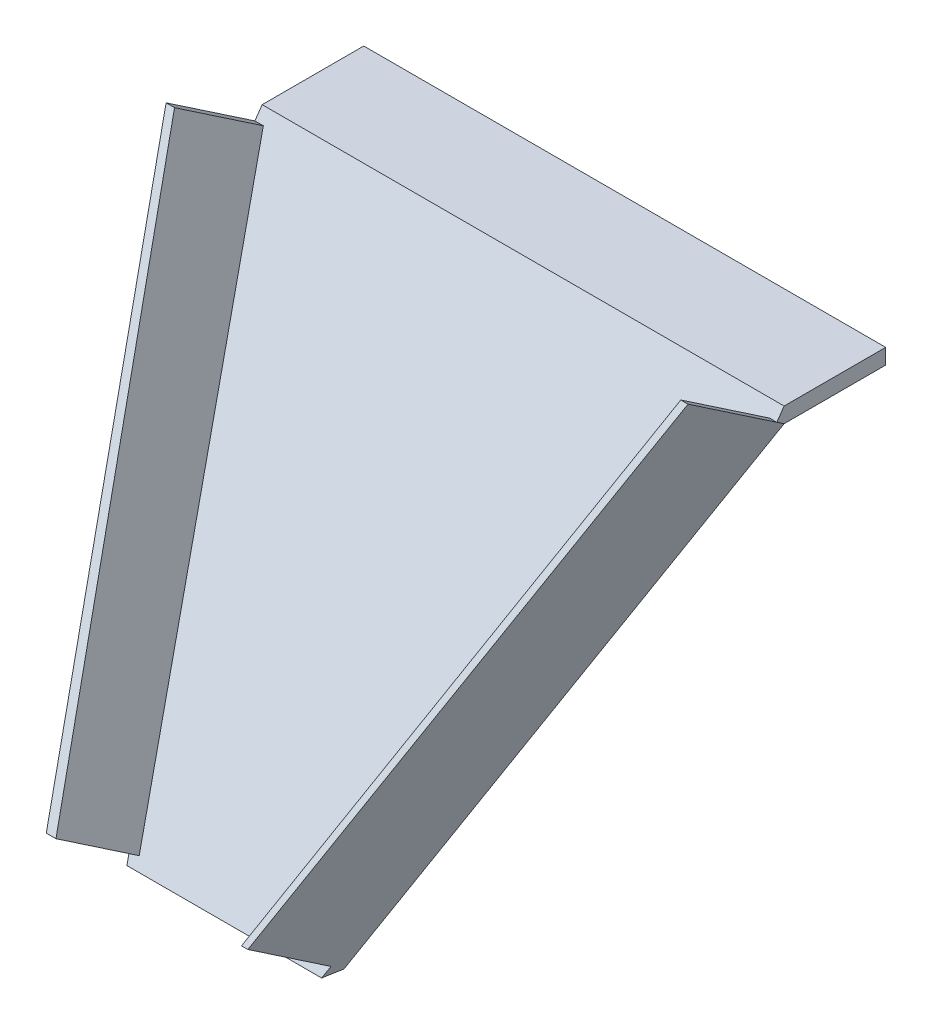
ISO-10303-21;
HEADER;
FILE_DESCRIPTION(('STEP AP214'),'2;1');
FILE_NAME('part.step','',(''),(''),'','','');
FILE_SCHEMA(('AUTOMOTIVE_DESIGN { 1 0 10303 214 1 1 1 1 }'));
ENDSEC;
DATA;
#1=APPLICATION_CONTEXT('core data for automotive mechanical design processes');
#2=APPLICATION_PROTOCOL_DEFINITION('international standard','automotive_design',2000,#1);
#3=PRODUCT_CONTEXT('',#1,'mechanical');
#4=PRODUCT('Part','Part','',(#3));
#5=PRODUCT_RELATED_PRODUCT_CATEGORY('part','',(#4));
#6=PRODUCT_DEFINITION_FORMATION('','',#4);
#7=PRODUCT_DEFINITION_CONTEXT('part definition',#1,'design');
#8=PRODUCT_DEFINITION('design','',#6,#7);
#9=PRODUCT_DEFINITION_SHAPE('','',#8);
#10=(LENGTH_UNIT() NAMED_UNIT(*) SI_UNIT(.MILLI.,.METRE.));
#11=(NAMED_UNIT(*) PLANE_ANGLE_UNIT() SI_UNIT($,.RADIAN.));
#12=(NAMED_UNIT(*) SI_UNIT($,.STERADIAN.) SOLID_ANGLE_UNIT());
#13=UNCERTAINTY_MEASURE_WITH_UNIT(LENGTH_MEASURE(1.E-05),#10,'distance_accuracy_value','');
#14=(GEOMETRIC_REPRESENTATION_CONTEXT(3) GLOBAL_UNCERTAINTY_ASSIGNED_CONTEXT((#13)) GLOBAL_UNIT_ASSIGNED_CONTEXT((#10,
#11,#12)) REPRESENTATION_CONTEXT('',''));
#15=CARTESIAN_POINT('',(0.,0.,0.));
#16=DIRECTION('',(0.,0.,1.));
#17=DIRECTION('',(1.,0.,0.));
#18=AXIS2_PLACEMENT_3D('',#15,#16,#17);
#19=CARTESIAN_POINT('',(90.,-36.9293149647872,25.7143091727455));
#20=DIRECTION('',(0.,-0.571429092727677,-0.820651443661938));
#21=DIRECTION('',(0.,0.820651443661939,-0.571429092727677));
#22=AXIS2_PLACEMENT_3D('',#19,#20,#21);
#23=PLANE('',#22);
#24=DIRECTION('',(0.,-0.820651443661939,0.571429092727677));
#25=VECTOR('',#24,1.);
#26=CARTESIAN_POINT('',(0.,-36.9293149647872,25.7143091727455));
#27=LINE('',#26,#25);
#28=CARTESIAN_POINT('',(0.,36.9293149647872,-25.7143091727455));
#29=VERTEX_POINT('',#28);
#30=CARTESIAN_POINT('',(0.,35.1297081186427,-24.4612221096555));
#31=VERTEX_POINT('',#30);
#32=EDGE_CURVE('E226',#29,#31,#27,.T.);
#33=ORIENTED_EDGE('',*,*,#32,.T.);
#34=DIRECTION('',(1.,0.,0.));
#35=VECTOR('',#34,1.);
#36=CARTESIAN_POINT('',(90.,35.1297081186427,-24.4612221096555));
#37=LINE('',#36,#35);
#38=CARTESIAN_POINT('',(1.45587804217857,35.1297081186427,-24.4612221096555));
#39=VERTEX_POINT('',#38);
#40=EDGE_CURVE('E11',#31,#39,#37,.T.);
#41=ORIENTED_EDGE('',*,*,#40,.T.);
#42=DIRECTION('',(0.306921069880364,-0.781042678727612,0.543849051547844));
#43=VECTOR('',#42,1.);
#44=CARTESIAN_POINT('',(35.445896171002,-51.3669759300753,35.7674195038387));
#45=LINE('',#44,#43);
#46=CARTESIAN_POINT('',(29.1844345893238,-35.4330137279682,24.6724173137762));
#47=VERTEX_POINT('',#46);
#48=EDGE_CURVE('E47',#39,#47,#45,.T.);
#49=ORIENTED_EDGE('',*,*,#48,.T.);
#50=DIRECTION('',(-1.,0.,0.));
#51=VECTOR('',#50,1.);
#52=CARTESIAN_POINT('',(90.,-35.4330137279682,24.6724173137762));
#53=LINE('',#52,#51);
#54=CARTESIAN_POINT('',(27.5187848006722,-35.4330137279682,24.6724173137762));
#55=VERTEX_POINT('',#54);
#56=EDGE_CURVE('E170',#47,#55,#53,.T.);
#57=ORIENTED_EDGE('',*,*,#56,.T.);
#58=DIRECTION('',(-0.30481563473319,0.78159777054003,-0.544235568397598));
#59=VECTOR('',#58,1.);
#60=CARTESIAN_POINT('',(33.8533997946787,-51.676015701534,35.9826074713799));
#61=LINE('',#60,#59);
#62=CARTESIAN_POINT('',(28.102327933015,-36.9293149647872,25.7143091727454));
#63=VERTEX_POINT('',#62);
#64=EDGE_CURVE('E203',#63,#55,#61,.T.);
#65=ORIENTED_EDGE('',*,*,#64,.F.);
#66=DIRECTION('',(-1.,0.,0.));
#67=VECTOR('',#66,1.);
#68=CARTESIAN_POINT('',(90.,-36.9293149647872,25.7143091727455));
#69=LINE('',#68,#67);
#70=CARTESIAN_POINT('',(61.6828527856791,-36.9293149647872,25.7143091727455));
#71=VERTEX_POINT('',#70);
#72=EDGE_CURVE('E241',#71,#63,#69,.T.);
#73=ORIENTED_EDGE('',*,*,#72,.F.);
#74=DIRECTION('',(0.306926953426735,0.781041121639498,-0.543847967329379));
#75=VECTOR('',#74,1.);
#76=CARTESIAN_POINT('',(64.3504457036472,-30.1410556038357,20.9875656596656));
#77=LINE('',#76,#75);
#78=CARTESIAN_POINT('',(62.2708566273482,-35.4330137279682,24.6724173137762));
#79=VERTEX_POINT('',#78);
#80=EDGE_CURVE('E209',#71,#79,#77,.T.);
#81=ORIENTED_EDGE('',*,*,#80,.T.);
#82=DIRECTION('',(-1.,0.,0.));
#83=VECTOR('',#82,1.);
#84=CARTESIAN_POINT('',(90.,-35.4330137279682,24.6724173137762));
#85=LINE('',#84,#83);
#86=CARTESIAN_POINT('',(61.177479126101,-35.4330137279682,24.6724173137762));
#87=VERTEX_POINT('',#86);
#88=EDGE_CURVE('E186',#79,#87,#85,.T.);
#89=ORIENTED_EDGE('',*,*,#88,.T.);
#90=DIRECTION('',(0.305382790418016,0.781448656351428,-0.544131738463265));
#91=VECTOR('',#90,1.);
#92=CARTESIAN_POINT('',(63.3352201193224,-29.9115375583413,20.827749589744));
#93=LINE('',#92,#91);
#94=CARTESIAN_POINT('',(88.7527276365004,35.1297081186427,-24.4612221096555));
#95=VERTEX_POINT('',#94);
#96=EDGE_CURVE('E254',#87,#95,#93,.T.);
#97=ORIENTED_EDGE('',*,*,#96,.T.);
#98=DIRECTION('',(1.,0.,0.));
#99=VECTOR('',#98,1.);
#100=CARTESIAN_POINT('',(90.,35.1297081186427,-24.4612221096555));
#101=LINE('',#100,#99);
#102=CARTESIAN_POINT('',(90.,35.1297081186427,-24.4612221096555));
#103=VERTEX_POINT('',#102);
#104=EDGE_CURVE('E256',#95,#103,#101,.T.);
#105=ORIENTED_EDGE('',*,*,#104,.T.);
#106=DIRECTION('',(0.,-0.820651443661939,0.571429092727677));
#107=VECTOR('',#106,1.);
#108=CARTESIAN_POINT('',(90.,-36.9293149647872,25.7143091727455));
#109=LINE('',#108,#107);
#110=CARTESIAN_POINT('',(90.,36.9293149647872,-25.7143091727455));
#111=VERTEX_POINT('',#110);
#112=EDGE_CURVE('E220',#111,#103,#109,.T.);
#113=ORIENTED_EDGE('',*,*,#112,.F.);
#114=DIRECTION('',(-1.,0.,0.));
#115=VECTOR('',#114,1.);
#116=CARTESIAN_POINT('',(90.,36.9293149647872,-25.7143091727455));
#117=LINE('',#116,#115);
#118=EDGE_CURVE('E247',#111,#29,#117,.T.);
#119=ORIENTED_EDGE('',*,*,#118,.T.);
#120=EDGE_LOOP('',(#33,#41,#49,#57,#65,#73,#81,#89,#97,#105,#113,#119));
#121=FACE_BOUND('',#120,.T.);
#122=ADVANCED_FACE('F41',(#121),#23,.F.);
#123=CARTESIAN_POINT('',(90.,-36.9293149647872,22.460611747735));
#124=DIRECTION('',(0.,1.,0.));
#125=DIRECTION('',(0.,0.,1.));
#126=AXIS2_PLACEMENT_3D('',#123,#124,#125);
#127=PLANE('',#126);
#128=DIRECTION('',(0.176531051945329,0.,0.984295071459304));
#129=VECTOR('',#128,1.);
#130=CARTESIAN_POINT('',(29.4659001747486,-36.9293149647872,33.3172630005672));
#131=LINE('',#130,#129);
#132=CARTESIAN_POINT('',(27.5187848006722,-36.9293149647872,22.460611747735));
#133=VERTEX_POINT('',#132);
#134=EDGE_CURVE('E200',#133,#63,#131,.T.);
#135=ORIENTED_EDGE('',*,*,#134,.F.);
#136=DIRECTION('',(-1.,0.,0.));
#137=VECTOR('',#136,1.);
#138=CARTESIAN_POINT('',(90.,-36.9293149647872,22.460611747735));
#139=LINE('',#138,#137);
#140=CARTESIAN_POINT('',(62.2708566273482,-36.9293149647872,22.460611747735));
#141=VERTEX_POINT('',#140);
#142=EDGE_CURVE('E243',#141,#133,#139,.T.);
#143=ORIENTED_EDGE('',*,*,#142,.F.);
#144=DIRECTION('',(-0.177837966354275,0.,0.984059783612244));
#145=VECTOR('',#144,1.);
#146=CARTESIAN_POINT('',(63.1478280067003,-36.9293149647872,17.6079231824585));
#147=LINE('',#146,#145);
#148=EDGE_CURVE('E210',#141,#71,#147,.T.);
#149=ORIENTED_EDGE('',*,*,#148,.T.);
#150=ORIENTED_EDGE('',*,*,#72,.T.);
#151=EDGE_LOOP('',(#135,#143,#149,#150));
#152=FACE_BOUND('',#151,.T.);
#153=ADVANCED_FACE('F292',(#152),#127,.F.);
#154=CARTESIAN_POINT('',(90.,34.2819863518061,-25.7143091727455));
#155=DIRECTION('',(0.,0.560329875322556,0.828269539957259));
#156=DIRECTION('',(0.,-0.828269539957259,0.560329875322556));
#157=AXIS2_PLACEMENT_3D('',#154,#155,#156);
#158=PLANE('',#157);
#159=DIRECTION('',(0.304840690956023,-0.788846689796331,0.53366005390588));
#160=VECTOR('',#159,1.);
#161=CARTESIAN_POINT('',(8.3635062176291,12.6394550539764,-11.0729922115988));
#162=LINE('',#161,#160);
#163=CARTESIAN_POINT('',(0.,34.2819863518061,-25.7143091727455));
#164=VERTEX_POINT('',#163);
#165=EDGE_CURVE('E198',#164,#133,#162,.T.);
#166=ORIENTED_EDGE('',*,*,#165,.F.);
#167=DIRECTION('',(-1.,0.,0.));
#168=VECTOR('',#167,1.);
#169=CARTESIAN_POINT('',(90.,34.2819863518061,-25.7143091727455));
#170=LINE('',#169,#168);
#171=CARTESIAN_POINT('',(90.,34.2819863518061,-25.7143091727455));
#172=VERTEX_POINT('',#171);
#173=EDGE_CURVE('E239',#172,#164,#170,.T.);
#174=ORIENTED_EDGE('',*,*,#173,.F.);
#175=DIRECTION('',(-0.306952147273986,-0.788284785993833,0.533279922230854));
#176=VECTOR('',#175,1.);
#177=CARTESIAN_POINT('',(90.,34.2819863518061,-25.7143091727455));
#178=LINE('',#177,#176);
#179=EDGE_CURVE('E204',#172,#141,#178,.T.);
#180=ORIENTED_EDGE('',*,*,#179,.T.);
#181=ORIENTED_EDGE('',*,*,#142,.T.);
#182=EDGE_LOOP('',(#166,#174,#180,#181));
#183=FACE_BOUND('',#182,.T.);
#184=ADVANCED_FACE('F290',(#183),#158,.F.);
#185=CARTESIAN_POINT('',(90.,36.9293149647872,-25.7143091727455));
#186=DIRECTION('',(0.,-1.,0.));
#187=DIRECTION('',(0.,0.,-1.));
#188=AXIS2_PLACEMENT_3D('',#185,#186,#187);
#189=PLANE('',#188);
#190=DIRECTION('',(0.,0.,1.));
#191=VECTOR('',#190,1.);
#192=CARTESIAN_POINT('',(0.,36.9293149647872,-25.7143091727455));
#193=LINE('',#192,#191);
#194=CARTESIAN_POINT('',(0.,36.9293149647872,-43.2324556948885));
#195=VERTEX_POINT('',#194);
#196=EDGE_CURVE('E213',#195,#29,#193,.T.);
#197=ORIENTED_EDGE('',*,*,#196,.T.);
#198=ORIENTED_EDGE('',*,*,#118,.F.);
#199=DIRECTION('',(0.,0.,1.));
#200=VECTOR('',#199,1.);
#201=CARTESIAN_POINT('',(90.,36.9293149647872,-25.7143091727455));
#202=LINE('',#201,#200);
#203=CARTESIAN_POINT('',(90.,36.9293149647872,-43.2324556948885));
#204=VERTEX_POINT('',#203);
#205=EDGE_CURVE('E212',#204,#111,#202,.T.);
#206=ORIENTED_EDGE('',*,*,#205,.F.);
#207=DIRECTION('',(-1.,0.,0.));
#208=VECTOR('',#207,1.);
#209=CARTESIAN_POINT('',(90.,36.9293149647872,-43.2324556948885));
#210=LINE('',#209,#208);
#211=EDGE_CURVE('E223',#204,#195,#210,.T.);
#212=ORIENTED_EDGE('',*,*,#211,.T.);
#213=EDGE_LOOP('',(#197,#198,#206,#212));
#214=FACE_BOUND('',#213,.T.);
#215=ADVANCED_FACE('F43',(#214),#189,.F.);
#216=CARTESIAN_POINT('',(90.,34.2819863518061,-43.2324556948885));
#217=DIRECTION('',(0.,1.,0.));
#218=DIRECTION('',(0.,0.,1.));
#219=AXIS2_PLACEMENT_3D('',#216,#217,#218);
#220=PLANE('',#219);
#221=DIRECTION('',(0.,0.,-1.));
#222=VECTOR('',#221,1.);
#223=CARTESIAN_POINT('',(0.,34.2819863518061,-43.2324556948885));
#224=LINE('',#223,#222);
#225=CARTESIAN_POINT('',(0.,34.2819863518061,-43.2324556948885));
#226=VERTEX_POINT('',#225);
#227=EDGE_CURVE('E232',#164,#226,#224,.T.);
#228=ORIENTED_EDGE('',*,*,#227,.T.);
#229=DIRECTION('',(-1.,0.,0.));
#230=VECTOR('',#229,1.);
#231=CARTESIAN_POINT('',(90.,34.2819863518061,-43.2324556948885));
#232=LINE('',#231,#230);
#233=CARTESIAN_POINT('',(90.,34.2819863518061,-43.2324556948885));
#234=VERTEX_POINT('',#233);
#235=EDGE_CURVE('E237',#234,#226,#232,.T.);
#236=ORIENTED_EDGE('',*,*,#235,.F.);
#237=DIRECTION('',(0.,0.,-1.));
#238=VECTOR('',#237,1.);
#239=CARTESIAN_POINT('',(90.,34.2819863518061,-43.2324556948885));
#240=LINE('',#239,#238);
#241=EDGE_CURVE('E222',#172,#234,#240,.T.);
#242=ORIENTED_EDGE('',*,*,#241,.F.);
#243=ORIENTED_EDGE('',*,*,#173,.T.);
#244=EDGE_LOOP('',(#228,#236,#242,#243));
#245=FACE_BOUND('',#244,.T.);
#246=ADVANCED_FACE('F272',(#245),#220,.F.);
#247=CARTESIAN_POINT('',(90.,36.9293149647872,-43.2324556948885));
#248=DIRECTION('',(0.,0.,1.));
#249=DIRECTION('',(1.,0.,0.));
#250=AXIS2_PLACEMENT_3D('',#247,#248,#249);
#251=PLANE('',#250);
#252=DIRECTION('',(0.,1.,0.));
#253=VECTOR('',#252,1.);
#254=CARTESIAN_POINT('',(0.,36.9293149647872,-43.2324556948885));
#255=LINE('',#254,#253);
#256=EDGE_CURVE('E217',#226,#195,#255,.T.);
#257=ORIENTED_EDGE('',*,*,#256,.T.);
#258=ORIENTED_EDGE('',*,*,#211,.F.);
#259=DIRECTION('',(0.,1.,0.));
#260=VECTOR('',#259,1.);
#261=CARTESIAN_POINT('',(90.,36.9293149647872,-43.2324556948885));
#262=LINE('',#261,#260);
#263=EDGE_CURVE('E224',#234,#204,#262,.T.);
#264=ORIENTED_EDGE('',*,*,#263,.F.);
#265=ORIENTED_EDGE('',*,*,#235,.T.);
#266=EDGE_LOOP('',(#257,#258,#264,#265));
#267=FACE_BOUND('',#266,.T.);
#268=ADVANCED_FACE('F279',(#267),#251,.F.);
#269=CARTESIAN_POINT('',(90.,0.,0.));
#270=DIRECTION('',(-1.,0.,0.));
#271=DIRECTION('',(0.,0.,1.));
#272=AXIS2_PLACEMENT_3D('',#269,#270,#271);
#273=PLANE('',#272);
#274=ORIENTED_EDGE('',*,*,#112,.T.);
#275=DIRECTION('',(0.,-0.560329875322556,-0.828269539957259));
#276=VECTOR('',#275,1.);
#277=CARTESIAN_POINT('',(90.,35.4526039321256,-23.9839233278734));
#278=LINE('',#277,#276);
#279=EDGE_CURVE('E246',#103,#172,#278,.T.);
#280=ORIENTED_EDGE('',*,*,#279,.T.);
#281=ORIENTED_EDGE('',*,*,#241,.T.);
#282=ORIENTED_EDGE('',*,*,#263,.T.);
#283=ORIENTED_EDGE('',*,*,#205,.T.);
#284=EDGE_LOOP('',(#274,#280,#281,#282,#283));
#285=FACE_BOUND('',#284,.T.);
#286=ADVANCED_FACE('F285',(#285),#273,.F.);
#287=CARTESIAN_POINT('',(0.,0.,0.));
#288=DIRECTION('',(-1.,0.,0.));
#289=DIRECTION('',(0.,0.,1.));
#290=AXIS2_PLACEMENT_3D('',#287,#288,#289);
#291=PLANE('',#290);
#292=DIRECTION('',(0.,-0.560329875322556,-0.828269539957259));
#293=VECTOR('',#292,1.);
#294=CARTESIAN_POINT('',(0.,35.4526039321256,-23.9839233278734));
#295=LINE('',#294,#293);
#296=EDGE_CURVE('E252',#31,#164,#295,.T.);
#297=ORIENTED_EDGE('',*,*,#296,.F.);
#298=ORIENTED_EDGE('',*,*,#32,.F.);
#299=ORIENTED_EDGE('',*,*,#196,.F.);
#300=ORIENTED_EDGE('',*,*,#256,.F.);
#301=ORIENTED_EDGE('',*,*,#227,.F.);
#302=EDGE_LOOP('',(#297,#298,#299,#300,#301));
#303=FACE_BOUND('',#302,.T.);
#304=ADVANCED_FACE('F268',(#303),#291,.T.);
#305=CARTESIAN_POINT('',(90.,3.79355993918753,-70.7817525323621));
#306=DIRECTION('',(-0.951724949386055,0.254239113811517,-0.171994458412024));
#307=DIRECTION('',(-0.25808511965984,-0.966122182236888,0.));
#308=AXIS2_PLACEMENT_3D('',#305,#306,#307);
#309=PLANE('',#308);
#310=ORIENTED_EDGE('',*,*,#279,.F.);
#311=DIRECTION('',(0.,-0.560329875322556,-0.828269539957259));
#312=VECTOR('',#311,1.);
#313=CARTESIAN_POINT('',(90.,45.4885838582572,-9.14891837360031));
#314=LINE('',#313,#312);
#315=CARTESIAN_POINT('',(90.,45.4885838582572,-9.14891837360031));
#316=VERTEX_POINT('',#315);
#317=EDGE_CURVE('E184',#316,#103,#314,.T.);
#318=ORIENTED_EDGE('',*,*,#317,.F.);
#319=DIRECTION('',(-0.306952147273986,-0.788284785993833,0.533279922230854));
#320=VECTOR('',#319,1.);
#321=CARTESIAN_POINT('',(90.,45.4885838582572,-9.14891837360031));
#322=LINE('',#321,#320);
#323=CARTESIAN_POINT('',(62.2708566273482,-25.7227174583361,39.0260025468802));
#324=VERTEX_POINT('',#323);
#325=EDGE_CURVE('E177',#316,#324,#322,.T.);
#326=ORIENTED_EDGE('',*,*,#325,.T.);
#327=DIRECTION('',(0.,-0.560329875322556,-0.828269539957259));
#328=VECTOR('',#327,1.);
#329=CARTESIAN_POINT('',(62.2708566273482,-25.7227174583361,39.0260025468802));
#330=LINE('',#329,#328);
#331=EDGE_CURVE('E187',#324,#79,#330,.T.);
#332=ORIENTED_EDGE('',*,*,#331,.T.);
#333=ORIENTED_EDGE('',*,*,#80,.F.);
#334=ORIENTED_EDGE('',*,*,#148,.F.);
#335=ORIENTED_EDGE('',*,*,#179,.F.);
#336=EDGE_LOOP('',(#310,#318,#326,#332,#333,#334,#335));
#337=FACE_BOUND('',#336,.T.);
#338=ADVANCED_FACE('F318',(#337),#309,.F.);
#339=CARTESIAN_POINT('',(0.,3.79355993918753,-70.7817525323621));
#340=DIRECTION('',(-0.952403356324123,-0.252490258858398,0.17081134635663));
#341=DIRECTION('',(0.256256264439573,-0.966608880021012,0.));
#342=AXIS2_PLACEMENT_3D('',#339,#340,#341);
#343=PLANE('',#342);
#344=ORIENTED_EDGE('',*,*,#165,.T.);
#345=ORIENTED_EDGE('',*,*,#134,.T.);
#346=ORIENTED_EDGE('',*,*,#64,.T.);
#347=DIRECTION('',(0.,-0.560329875322556,-0.828269539957259));
#348=VECTOR('',#347,1.);
#349=CARTESIAN_POINT('',(27.5187848006722,-25.7227174583361,39.0260025468802));
#350=LINE('',#349,#348);
#351=CARTESIAN_POINT('',(27.5187848006722,-25.7227174583361,39.0260025468802));
#352=VERTEX_POINT('',#351);
#353=EDGE_CURVE('E169',#352,#55,#350,.T.);
#354=ORIENTED_EDGE('',*,*,#353,.F.);
#355=DIRECTION('',(-0.304840690956023,0.788846689796331,-0.53366005390588));
#356=VECTOR('',#355,1.);
#357=CARTESIAN_POINT('',(12.4271145956202,13.3305140752147,12.6062306000974));
#358=LINE('',#357,#356);
#359=CARTESIAN_POINT('',(0.,45.4885838582572,-9.14891837360031));
#360=VERTEX_POINT('',#359);
#361=EDGE_CURVE('E150',#352,#360,#358,.T.);
#362=ORIENTED_EDGE('',*,*,#361,.T.);
#363=DIRECTION('',(0.,-0.560329875322556,-0.828269539957259));
#364=VECTOR('',#363,1.);
#365=CARTESIAN_POINT('',(0.,45.4885838582572,-9.14891837360031));
#366=LINE('',#365,#364);
#367=EDGE_CURVE('E161',#360,#31,#366,.T.);
#368=ORIENTED_EDGE('',*,*,#367,.T.);
#369=ORIENTED_EDGE('',*,*,#296,.T.);
#370=EDGE_LOOP('',(#344,#345,#346,#354,#362,#368,#369));
#371=FACE_BOUND('',#370,.T.);
#372=ADVANCED_FACE('F262',(#371),#343,.T.);
#373=CARTESIAN_POINT('',(88.7527276365004,45.4885838582572,-9.14891837360031));
#374=DIRECTION('',(0.,0.828269539957259,-0.560329875322556));
#375=DIRECTION('',(0.,0.560329875322556,0.828269539957259));
#376=AXIS2_PLACEMENT_3D('',#373,#374,#375);
#377=PLANE('',#376);
#378=ORIENTED_EDGE('',*,*,#104,.F.);
#379=DIRECTION('',(0.,-0.560329875322556,-0.828269539957259));
#380=VECTOR('',#379,1.);
#381=CARTESIAN_POINT('',(88.7527276365004,45.4885838582572,-9.14891837360031));
#382=LINE('',#381,#380);
#383=CARTESIAN_POINT('',(88.7527276365004,45.4885838582572,-9.14891837360031));
#384=VERTEX_POINT('',#383);
#385=EDGE_CURVE('E183',#384,#95,#382,.T.);
#386=ORIENTED_EDGE('',*,*,#385,.F.);
#387=DIRECTION('',(1.,0.,0.));
#388=VECTOR('',#387,1.);
#389=CARTESIAN_POINT('',(88.7527276365004,45.4885838582572,-9.14891837360031));
#390=LINE('',#389,#388);
#391=EDGE_CURVE('E171',#384,#316,#390,.T.);
#392=ORIENTED_EDGE('',*,*,#391,.T.);
#393=ORIENTED_EDGE('',*,*,#317,.T.);
#394=EDGE_LOOP('',(#378,#386,#392,#393));
#395=FACE_BOUND('',#394,.T.);
#396=ADVANCED_FACE('F324',(#395),#377,.T.);
#397=CARTESIAN_POINT('',(88.7527276365004,45.4885838582572,-9.14891837360031));
#398=DIRECTION('',(-0.952221625770053,0.252960047317586,-0.171129161386721));
#399=DIRECTION('',(-0.256747430540851,-0.966478534117893,0.));
#400=AXIS2_PLACEMENT_3D('',#397,#398,#399);
#401=PLANE('',#400);
#402=ORIENTED_EDGE('',*,*,#96,.F.);
#403=DIRECTION('',(0.,-0.560329875322556,-0.828269539957259));
#404=VECTOR('',#403,1.);
#405=CARTESIAN_POINT('',(61.177479126101,-25.7227174583361,39.0260025468802));
#406=LINE('',#405,#404);
#407=CARTESIAN_POINT('',(61.177479126101,-25.7227174583361,39.0260025468802));
#408=VERTEX_POINT('',#407);
#409=EDGE_CURVE('E64',#408,#87,#406,.T.);
#410=ORIENTED_EDGE('',*,*,#409,.F.);
#411=DIRECTION('',(0.305407883683178,0.788696167913915,-0.533558224847175));
#412=VECTOR('',#411,1.);
#413=CARTESIAN_POINT('',(88.7527276365004,45.4885838582572,-9.14891837360031));
#414=LINE('',#413,#412);
#415=EDGE_CURVE('E182',#408,#384,#414,.T.);
#416=ORIENTED_EDGE('',*,*,#415,.T.);
#417=ORIENTED_EDGE('',*,*,#385,.T.);
#418=EDGE_LOOP('',(#402,#410,#416,#417));
#419=FACE_BOUND('',#418,.T.);
#420=ADVANCED_FACE('F327',(#419),#401,.T.);
#421=CARTESIAN_POINT('',(62.2708566273482,-25.7227174583361,39.0260025468802));
#422=DIRECTION('',(0.,-0.828269539957259,0.560329875322556));
#423=DIRECTION('',(0.,-0.560329875322556,-0.828269539957259));
#424=AXIS2_PLACEMENT_3D('',#421,#422,#423);
#425=PLANE('',#424);
#426=ORIENTED_EDGE('',*,*,#88,.F.);
#427=ORIENTED_EDGE('',*,*,#331,.F.);
#428=DIRECTION('',(-1.,0.,0.));
#429=VECTOR('',#428,1.);
#430=CARTESIAN_POINT('',(62.2708566273482,-25.7227174583361,39.0260025468802));
#431=LINE('',#430,#429);
#432=EDGE_CURVE('E176',#324,#408,#431,.T.);
#433=ORIENTED_EDGE('',*,*,#432,.T.);
#434=ORIENTED_EDGE('',*,*,#409,.T.);
#435=EDGE_LOOP('',(#426,#427,#433,#434));
#436=FACE_BOUND('',#435,.T.);
#437=ADVANCED_FACE('F329',(#436),#425,.T.);
#438=CARTESIAN_POINT('',(0.,10.0359799261316,14.8350049542731));
#439=DIRECTION('',(0.,-0.560329875322556,-0.828269539957259));
#440=DIRECTION('',(0.,0.828269539957259,-0.560329875322556));
#441=AXIS2_PLACEMENT_3D('',#438,#439,#440);
#442=PLANE('',#441);
#443=ORIENTED_EDGE('',*,*,#391,.F.);
#444=ORIENTED_EDGE('',*,*,#415,.F.);
#445=ORIENTED_EDGE('',*,*,#432,.F.);
#446=ORIENTED_EDGE('',*,*,#325,.F.);
#447=EDGE_LOOP('',(#443,#444,#445,#446));
#448=FACE_BOUND('',#447,.T.);
#449=ADVANCED_FACE('F334',(#448),#442,.F.);
#450=CARTESIAN_POINT('',(0.,45.4885838582572,-9.14891837360031));
#451=DIRECTION('',(0.,0.828269539957259,-0.560329875322556));
#452=DIRECTION('',(0.,0.560329875322556,0.828269539957259));
#453=AXIS2_PLACEMENT_3D('',#450,#451,#452);
#454=PLANE('',#453);
#455=ORIENTED_EDGE('',*,*,#40,.F.);
#456=ORIENTED_EDGE('',*,*,#367,.F.);
#457=DIRECTION('',(1.,0.,0.));
#458=VECTOR('',#457,1.);
#459=CARTESIAN_POINT('',(0.,45.4885838582572,-9.14891837360031));
#460=LINE('',#459,#458);
#461=CARTESIAN_POINT('',(1.45587804217857,45.4885838582572,-9.14891837360031));
#462=VERTEX_POINT('',#461);
#463=EDGE_CURVE('E152',#360,#462,#460,.T.);
#464=ORIENTED_EDGE('',*,*,#463,.T.);
#465=DIRECTION('',(0.,-0.560329875322556,-0.828269539957259));
#466=VECTOR('',#465,1.);
#467=CARTESIAN_POINT('',(1.45587804217857,45.4885838582572,-9.14891837360031));
#468=LINE('',#467,#466);
#469=EDGE_CURVE('E138',#462,#39,#468,.T.);
#470=ORIENTED_EDGE('',*,*,#469,.T.);
#471=EDGE_LOOP('',(#455,#456,#464,#470));
#472=FACE_BOUND('',#471,.T.);
#473=ADVANCED_FACE('F157',(#472),#454,.T.);
#474=CARTESIAN_POINT('',(13.8227730645994,13.7284492729986,12.3370247812136));
#475=DIRECTION('',(0.95172684706194,0.254234240332473,-0.171991161470903));
#476=DIRECTION('',(-0.258080021651755,0.966123544079239,0.));
#477=AXIS2_PLACEMENT_3D('',#474,#475,#476);
#478=PLANE('',#477);
#479=ORIENTED_EDGE('',*,*,#48,.F.);
#480=ORIENTED_EDGE('',*,*,#469,.F.);
#481=DIRECTION('',(0.306946263345133,-0.788286357780965,0.533280985555346));
#482=VECTOR('',#481,1.);
#483=CARTESIAN_POINT('',(13.8227730645994,13.7284492729986,12.3370247812136));
#484=LINE('',#483,#482);
#485=CARTESIAN_POINT('',(29.1844345893238,-25.7227174583361,39.0260025468802));
#486=VERTEX_POINT('',#485);
#487=EDGE_CURVE('E141',#462,#486,#484,.T.);
#488=ORIENTED_EDGE('',*,*,#487,.T.);
#489=DIRECTION('',(0.,-0.560329875322556,-0.828269539957259));
#490=VECTOR('',#489,1.);
#491=CARTESIAN_POINT('',(29.1844345893238,-25.7227174583361,39.0260025468802));
#492=LINE('',#491,#490);
#493=EDGE_CURVE('E57',#486,#47,#492,.T.);
#494=ORIENTED_EDGE('',*,*,#493,.T.);
#495=EDGE_LOOP('',(#479,#480,#488,#494));
#496=FACE_BOUND('',#495,.T.);
#497=ADVANCED_FACE('F142',(#496),#478,.T.);
#498=CARTESIAN_POINT('',(0.,-25.7227174583361,39.0260025468802));
#499=DIRECTION('',(0.,-0.828269539957259,0.560329875322556));
#500=DIRECTION('',(0.,-0.560329875322556,-0.828269539957259));
#501=AXIS2_PLACEMENT_3D('',#498,#499,#500);
#502=PLANE('',#501);
#503=ORIENTED_EDGE('',*,*,#56,.F.);
#504=ORIENTED_EDGE('',*,*,#493,.F.);
#505=DIRECTION('',(-1.,0.,0.));
#506=VECTOR('',#505,1.);
#507=CARTESIAN_POINT('',(0.,-25.7227174583361,39.0260025468802));
#508=LINE('',#507,#506);
#509=EDGE_CURVE('E160',#486,#352,#508,.T.);
#510=ORIENTED_EDGE('',*,*,#509,.T.);
#511=ORIENTED_EDGE('',*,*,#353,.T.);
#512=EDGE_LOOP('',(#503,#504,#510,#511));
#513=FACE_BOUND('',#512,.T.);
#514=ADVANCED_FACE('F294',(#513),#502,.T.);
#515=CARTESIAN_POINT('',(0.,10.0359799261316,14.8350049542731));
#516=DIRECTION('',(0.,-0.560329875322556,-0.828269539957259));
#517=DIRECTION('',(0.,0.828269539957259,-0.560329875322556));
#518=AXIS2_PLACEMENT_3D('',#515,#516,#517);
#519=PLANE('',#518);
#520=ORIENTED_EDGE('',*,*,#463,.F.);
#521=ORIENTED_EDGE('',*,*,#361,.F.);
#522=ORIENTED_EDGE('',*,*,#509,.F.);
#523=ORIENTED_EDGE('',*,*,#487,.F.);
#524=EDGE_LOOP('',(#520,#521,#522,#523));
#525=FACE_BOUND('',#524,.T.);
#526=ADVANCED_FACE('F155',(#525),#519,.F.);
#527=CLOSED_SHELL('',(#122,#153,#184,#215,#246,#268,#286,#304,#338,#372,#396,#420,#437,#449,
#473,#497,#514,#526));
#528=MANIFOLD_SOLID_BREP('B2',#527);
#529=ADVANCED_BREP_SHAPE_REPRESENTATION('',(#18,#528),#14);
#530=SHAPE_DEFINITION_REPRESENTATION(#9,#529);
ENDSEC;
END-ISO-10303-21;
